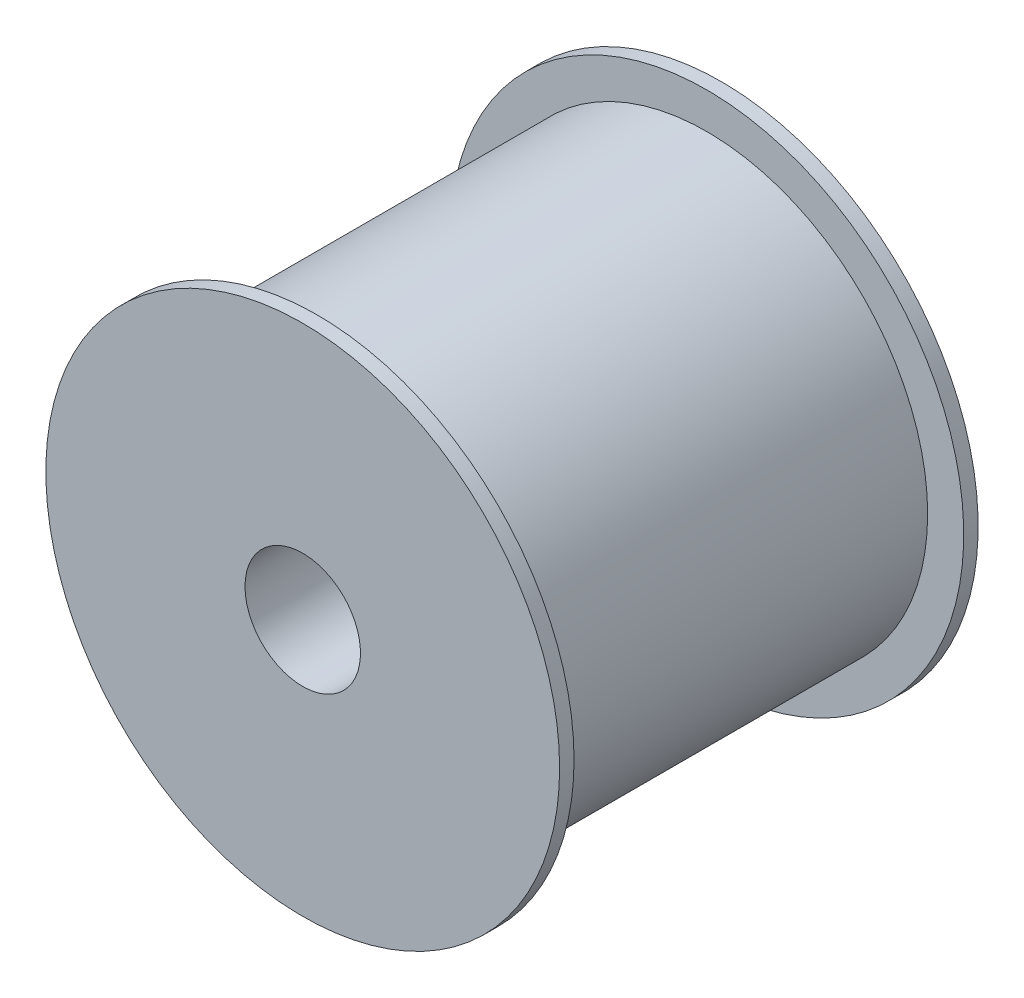
ISO-10303-21;
HEADER;
FILE_DESCRIPTION(('STEP AP214'),'2;1');
FILE_NAME('part.step','',(''),(''),'','','');
FILE_SCHEMA(('AUTOMOTIVE_DESIGN { 1 0 10303 214 1 1 1 1 }'));
ENDSEC;
DATA;
#1=APPLICATION_CONTEXT('core data for automotive mechanical design processes');
#2=APPLICATION_PROTOCOL_DEFINITION('international standard','automotive_design',2000,#1);
#3=PRODUCT_CONTEXT('',#1,'mechanical');
#4=PRODUCT('Part','Part','',(#3));
#5=PRODUCT_RELATED_PRODUCT_CATEGORY('part','',(#4));
#6=PRODUCT_DEFINITION_FORMATION('','',#4);
#7=PRODUCT_DEFINITION_CONTEXT('part definition',#1,'design');
#8=PRODUCT_DEFINITION('design','',#6,#7);
#9=PRODUCT_DEFINITION_SHAPE('','',#8);
#10=(LENGTH_UNIT() NAMED_UNIT(*) SI_UNIT(.MILLI.,.METRE.));
#11=(NAMED_UNIT(*) PLANE_ANGLE_UNIT() SI_UNIT($,.RADIAN.));
#12=(NAMED_UNIT(*) SI_UNIT($,.STERADIAN.) SOLID_ANGLE_UNIT());
#13=UNCERTAINTY_MEASURE_WITH_UNIT(LENGTH_MEASURE(1.E-05),#10,'distance_accuracy_value','');
#14=(GEOMETRIC_REPRESENTATION_CONTEXT(3) GLOBAL_UNCERTAINTY_ASSIGNED_CONTEXT((#13)) GLOBAL_UNIT_ASSIGNED_CONTEXT((#10,
#11,#12)) REPRESENTATION_CONTEXT('',''));
#15=CARTESIAN_POINT('',(0.,0.,0.));
#16=DIRECTION('',(0.,0.,1.));
#17=DIRECTION('',(1.,0.,0.));
#18=AXIS2_PLACEMENT_3D('',#15,#16,#17);
#19=CARTESIAN_POINT('',(0.,0.,27.));
#20=DIRECTION('',(0.,0.,-1.));
#21=DIRECTION('',(-1.,0.,0.));
#22=AXIS2_PLACEMENT_3D('',#19,#20,#21);
#23=CYLINDRICAL_SURFACE('',#22,15.3);
#24=CARTESIAN_POINT('',(0.,0.,27.));
#25=DIRECTION('',(0.,0.,1.));
#26=DIRECTION('',(1.,0.,0.));
#27=AXIS2_PLACEMENT_3D('',#24,#25,#26);
#28=CIRCLE('',#27,15.3);
#29=CARTESIAN_POINT('',(15.3,0.,27.));
#30=VERTEX_POINT('',#29);
#31=EDGE_CURVE('E10',#30,#30,#28,.T.);
#32=ORIENTED_EDGE('',*,*,#31,.F.);
#33=EDGE_LOOP('',(#32));
#34=FACE_BOUND('',#33,.T.);
#35=CARTESIAN_POINT('',(0.,0.,0.));
#36=DIRECTION('',(0.,0.,1.));
#37=DIRECTION('',(1.,0.,0.));
#38=AXIS2_PLACEMENT_3D('',#35,#36,#37);
#39=CIRCLE('',#38,15.3);
#40=CARTESIAN_POINT('',(15.3,0.,0.));
#41=VERTEX_POINT('',#40);
#42=EDGE_CURVE('E39',#41,#41,#39,.T.);
#43=ORIENTED_EDGE('',*,*,#42,.T.);
#44=EDGE_LOOP('',(#43));
#45=FACE_BOUND('',#44,.T.);
#46=ADVANCED_FACE('F36',(#34,#45),#23,.T.);
#47=CARTESIAN_POINT('',(0.,0.,28.));
#48=DIRECTION('',(0.,0.,-1.));
#49=DIRECTION('',(-1.,0.,0.));
#50=AXIS2_PLACEMENT_3D('',#47,#48,#49);
#51=CYLINDRICAL_SURFACE('',#50,17.8);
#52=CARTESIAN_POINT('',(0.,0.,28.));
#53=DIRECTION('',(0.,0.,1.));
#54=DIRECTION('',(1.,0.,0.));
#55=AXIS2_PLACEMENT_3D('',#52,#53,#54);
#56=CIRCLE('',#55,17.8);
#57=CARTESIAN_POINT('',(17.8,0.,28.));
#58=VERTEX_POINT('',#57);
#59=EDGE_CURVE('E43',#58,#58,#56,.T.);
#60=ORIENTED_EDGE('',*,*,#59,.F.);
#61=EDGE_LOOP('',(#60));
#62=FACE_BOUND('',#61,.T.);
#63=CARTESIAN_POINT('',(0.,0.,27.));
#64=DIRECTION('',(0.,0.,1.));
#65=DIRECTION('',(1.,0.,0.));
#66=AXIS2_PLACEMENT_3D('',#63,#64,#65);
#67=CIRCLE('',#66,17.8);
#68=CARTESIAN_POINT('',(17.8,0.,27.));
#69=VERTEX_POINT('',#68);
#70=EDGE_CURVE('E47',#69,#69,#67,.T.);
#71=ORIENTED_EDGE('',*,*,#70,.T.);
#72=EDGE_LOOP('',(#71));
#73=FACE_BOUND('',#72,.T.);
#74=ADVANCED_FACE('F95',(#62,#73),#51,.T.);
#75=CARTESIAN_POINT('',(0.,0.,28.));
#76=DIRECTION('',(0.,0.,1.));
#77=DIRECTION('',(1.,0.,0.));
#78=AXIS2_PLACEMENT_3D('',#75,#76,#77);
#79=PLANE('',#78);
#80=CARTESIAN_POINT('',(0.,0.,28.));
#81=DIRECTION('',(0.,0.,-1.));
#82=DIRECTION('',(-1.,0.,0.));
#83=AXIS2_PLACEMENT_3D('',#80,#81,#82);
#84=CIRCLE('',#83,4.);
#85=CARTESIAN_POINT('',(-4.,0.,28.));
#86=VERTEX_POINT('',#85);
#87=EDGE_CURVE('E56',#86,#86,#84,.T.);
#88=ORIENTED_EDGE('',*,*,#87,.T.);
#89=EDGE_LOOP('',(#88));
#90=FACE_BOUND('',#89,.T.);
#91=ORIENTED_EDGE('',*,*,#59,.T.);
#92=EDGE_LOOP('',(#91));
#93=FACE_BOUND('',#92,.T.);
#94=ADVANCED_FACE('F65',(#90,#93),#79,.T.);
#95=CARTESIAN_POINT('',(0.,0.,27.));
#96=DIRECTION('',(0.,0.,1.));
#97=DIRECTION('',(1.,0.,0.));
#98=AXIS2_PLACEMENT_3D('',#95,#96,#97);
#99=PLANE('',#98);
#100=ORIENTED_EDGE('',*,*,#31,.T.);
#101=EDGE_LOOP('',(#100));
#102=FACE_BOUND('',#101,.T.);
#103=ORIENTED_EDGE('',*,*,#70,.F.);
#104=EDGE_LOOP('',(#103));
#105=FACE_BOUND('',#104,.T.);
#106=ADVANCED_FACE('F84',(#102,#105),#99,.F.);
#107=CARTESIAN_POINT('',(0.,0.,-1.));
#108=DIRECTION('',(0.,0.,1.));
#109=DIRECTION('',(1.,0.,0.));
#110=AXIS2_PLACEMENT_3D('',#107,#108,#109);
#111=CYLINDRICAL_SURFACE('',#110,17.8);
#112=CARTESIAN_POINT('',(0.,0.,-1.));
#113=DIRECTION('',(0.,0.,-1.));
#114=DIRECTION('',(-1.,0.,0.));
#115=AXIS2_PLACEMENT_3D('',#112,#113,#114);
#116=CIRCLE('',#115,17.8);
#117=CARTESIAN_POINT('',(-17.8,0.,-1.));
#118=VERTEX_POINT('',#117);
#119=EDGE_CURVE('E55',#118,#118,#116,.T.);
#120=ORIENTED_EDGE('',*,*,#119,.F.);
#121=EDGE_LOOP('',(#120));
#122=FACE_BOUND('',#121,.T.);
#123=CARTESIAN_POINT('',(0.,0.,0.));
#124=DIRECTION('',(0.,0.,-1.));
#125=DIRECTION('',(-1.,0.,0.));
#126=AXIS2_PLACEMENT_3D('',#123,#124,#125);
#127=CIRCLE('',#126,17.8);
#128=CARTESIAN_POINT('',(-17.8,0.,0.));
#129=VERTEX_POINT('',#128);
#130=EDGE_CURVE('E52',#129,#129,#127,.T.);
#131=ORIENTED_EDGE('',*,*,#130,.T.);
#132=EDGE_LOOP('',(#131));
#133=FACE_BOUND('',#132,.T.);
#134=ADVANCED_FACE('F78',(#122,#133),#111,.T.);
#135=CARTESIAN_POINT('',(0.,0.,-1.));
#136=DIRECTION('',(0.,0.,-1.));
#137=DIRECTION('',(-1.,0.,0.));
#138=AXIS2_PLACEMENT_3D('',#135,#136,#137);
#139=PLANE('',#138);
#140=CARTESIAN_POINT('',(0.,0.,-1.));
#141=DIRECTION('',(0.,0.,-1.));
#142=DIRECTION('',(-1.,0.,0.));
#143=AXIS2_PLACEMENT_3D('',#140,#141,#142);
#144=CIRCLE('',#143,4.);
#145=CARTESIAN_POINT('',(-4.,0.,-1.));
#146=VERTEX_POINT('',#145);
#147=EDGE_CURVE('E59',#146,#146,#144,.T.);
#148=ORIENTED_EDGE('',*,*,#147,.F.);
#149=EDGE_LOOP('',(#148));
#150=FACE_BOUND('',#149,.T.);
#151=ORIENTED_EDGE('',*,*,#119,.T.);
#152=EDGE_LOOP('',(#151));
#153=FACE_BOUND('',#152,.T.);
#154=ADVANCED_FACE('F75',(#150,#153),#139,.T.);
#155=CARTESIAN_POINT('',(0.,0.,0.));
#156=DIRECTION('',(0.,0.,-1.));
#157=DIRECTION('',(-1.,0.,0.));
#158=AXIS2_PLACEMENT_3D('',#155,#156,#157);
#159=PLANE('',#158);
#160=ORIENTED_EDGE('',*,*,#42,.F.);
#161=EDGE_LOOP('',(#160));
#162=FACE_BOUND('',#161,.T.);
#163=ORIENTED_EDGE('',*,*,#130,.F.);
#164=EDGE_LOOP('',(#163));
#165=FACE_BOUND('',#164,.T.);
#166=ADVANCED_FACE('F71',(#162,#165),#159,.F.);
#167=CARTESIAN_POINT('',(0.,0.,28.));
#168=DIRECTION('',(0.,0.,-1.));
#169=DIRECTION('',(-1.,0.,0.));
#170=AXIS2_PLACEMENT_3D('',#167,#168,#169);
#171=CYLINDRICAL_SURFACE('',#170,4.);
#172=CARTESIAN_POINT('',(-4.,0.,28.));
#173=CARTESIAN_POINT('',(-4.,0.,27.6979166666667));
#174=CARTESIAN_POINT('',(-4.,0.,27.3958333333333));
#175=CARTESIAN_POINT('',(-4.,0.,26.7916666666667));
#176=CARTESIAN_POINT('',(-4.,0.,26.4895833333333));
#177=CARTESIAN_POINT('',(-4.,0.,25.8854166666667));
#178=CARTESIAN_POINT('',(-4.,0.,25.5833333333333));
#179=CARTESIAN_POINT('',(-4.,0.,24.9791666666667));
#180=CARTESIAN_POINT('',(-4.,0.,24.6770833333333));
#181=CARTESIAN_POINT('',(-4.,0.,24.0729166666667));
#182=CARTESIAN_POINT('',(-4.,0.,23.7708333333333));
#183=CARTESIAN_POINT('',(-4.,0.,23.1666666666667));
#184=CARTESIAN_POINT('',(-4.,0.,22.8645833333333));
#185=CARTESIAN_POINT('',(-4.,0.,22.2604166666667));
#186=CARTESIAN_POINT('',(-4.,0.,21.9583333333333));
#187=CARTESIAN_POINT('',(-4.,0.,21.3541666666667));
#188=CARTESIAN_POINT('',(-4.,0.,21.0520833333333));
#189=CARTESIAN_POINT('',(-4.,0.,20.4479166666667));
#190=CARTESIAN_POINT('',(-4.,0.,20.1458333333333));
#191=CARTESIAN_POINT('',(-4.,0.,19.5416666666667));
#192=CARTESIAN_POINT('',(-4.,0.,19.2395833333333));
#193=CARTESIAN_POINT('',(-4.,0.,18.6354166666667));
#194=CARTESIAN_POINT('',(-4.,0.,18.3333333333333));
#195=CARTESIAN_POINT('',(-4.,0.,17.7291666666667));
#196=CARTESIAN_POINT('',(-4.,0.,17.4270833333333));
#197=CARTESIAN_POINT('',(-4.,0.,16.8229166666667));
#198=CARTESIAN_POINT('',(-4.,0.,16.5208333333333));
#199=CARTESIAN_POINT('',(-4.,0.,15.9166666666667));
#200=CARTESIAN_POINT('',(-4.,0.,15.6145833333333));
#201=CARTESIAN_POINT('',(-4.,0.,15.0104166666667));
#202=CARTESIAN_POINT('',(-4.,0.,14.7083333333333));
#203=CARTESIAN_POINT('',(-4.,0.,14.1041666666667));
#204=CARTESIAN_POINT('',(-4.,0.,13.8020833333333));
#205=CARTESIAN_POINT('',(-4.,0.,13.1979166666667));
#206=CARTESIAN_POINT('',(-4.,0.,12.8958333333333));
#207=CARTESIAN_POINT('',(-4.,0.,12.2916666666667));
#208=CARTESIAN_POINT('',(-4.,0.,11.9895833333333));
#209=CARTESIAN_POINT('',(-4.,0.,11.3854166666667));
#210=CARTESIAN_POINT('',(-4.,0.,11.0833333333333));
#211=CARTESIAN_POINT('',(-4.,0.,10.4791666666667));
#212=CARTESIAN_POINT('',(-4.,0.,10.1770833333333));
#213=CARTESIAN_POINT('',(-4.,0.,9.57291666666667));
#214=CARTESIAN_POINT('',(-4.,0.,9.27083333333333));
#215=CARTESIAN_POINT('',(-4.,0.,8.66666666666667));
#216=CARTESIAN_POINT('',(-4.,0.,8.36458333333333));
#217=CARTESIAN_POINT('',(-4.,0.,7.76041666666667));
#218=CARTESIAN_POINT('',(-4.,0.,7.45833333333333));
#219=CARTESIAN_POINT('',(-4.,0.,6.85416666666667));
#220=CARTESIAN_POINT('',(-4.,0.,6.55208333333334));
#221=CARTESIAN_POINT('',(-4.,0.,5.94791666666667));
#222=CARTESIAN_POINT('',(-4.,0.,5.64583333333333));
#223=CARTESIAN_POINT('',(-4.,0.,5.04166666666667));
#224=CARTESIAN_POINT('',(-4.,0.,4.73958333333333));
#225=CARTESIAN_POINT('',(-4.,0.,4.13541666666667));
#226=CARTESIAN_POINT('',(-4.,0.,3.83333333333333));
#227=CARTESIAN_POINT('',(-4.,0.,3.22916666666667));
#228=CARTESIAN_POINT('',(-4.,0.,2.92708333333333));
#229=CARTESIAN_POINT('',(-4.,0.,2.32291666666667));
#230=CARTESIAN_POINT('',(-4.,0.,2.02083333333333));
#231=CARTESIAN_POINT('',(-4.,0.,1.41666666666667));
#232=CARTESIAN_POINT('',(-4.,0.,1.11458333333333));
#233=CARTESIAN_POINT('',(-4.,0.,0.510416666666667));
#234=CARTESIAN_POINT('',(-4.,0.,0.208333333333334));
#235=CARTESIAN_POINT('',(-4.,0.,-0.395833333333334));
#236=CARTESIAN_POINT('',(-4.,0.,-0.697916666666667));
#237=CARTESIAN_POINT('',(-4.,0.,-1.));
#238=B_SPLINE_CURVE_WITH_KNOTS('',3,(#172,#173,#174,#175,#176,#177,#178,#179,#180,#181,#182,
#183,#184,#185,#186,#187,#188,#189,#190,#191,#192,#193,#194,#195,#196,#197,#198,#199,#200,#201,
#202,#203,#204,#205,#206,#207,#208,#209,#210,#211,#212,#213,#214,#215,#216,#217,#218,#219,#220,
#221,#222,#223,#224,#225,#226,#227,#228,#229,#230,#231,#232,#233,#234,#235,#236,#237),
.UNSPECIFIED.,.F.,.F.,(4,2,2,2,2,2,2,2,2,2,2,2,2,2,2,2,2,2,2,2,2,2,2,2,2,2,2,2,2,2,2,2,4),(0.,
0.906250000000001,1.8125,2.71875,3.625,4.53125,5.4375,6.34375,7.25,8.15625,9.0625,
9.96875000000001,10.875,11.78125,12.6875,13.59375,14.5,15.40625,16.3125,17.21875,18.125,
19.03125,19.9375,20.84375,21.75,22.65625,23.5625,24.46875,25.375,26.28125,27.1875,28.09375,29.),.UNSPECIFIED.);
#239=EDGE_CURVE('BSEAM68',#86,#146,#238,.T.);
#240=ORIENTED_EDGE('',*,*,#87,.F.);
#241=ORIENTED_EDGE('',*,*,#147,.T.);
#242=ORIENTED_EDGE('',*,*,#239,.T.);
#243=ORIENTED_EDGE('',*,*,#239,.F.);
#244=EDGE_LOOP('',(#240,#242,#241,#243));
#245=FACE_BOUND('',#244,.T.);
#246=ADVANCED_FACE('F68',(#245),#171,.F.);
#247=CLOSED_SHELL('',(#46,#74,#94,#106,#134,#154,#166,#246));
#248=MANIFOLD_SOLID_BREP('B2',#247);
#249=ADVANCED_BREP_SHAPE_REPRESENTATION('',(#18,#248),#14);
#250=SHAPE_DEFINITION_REPRESENTATION(#9,#249);
ENDSEC;
END-ISO-10303-21;
